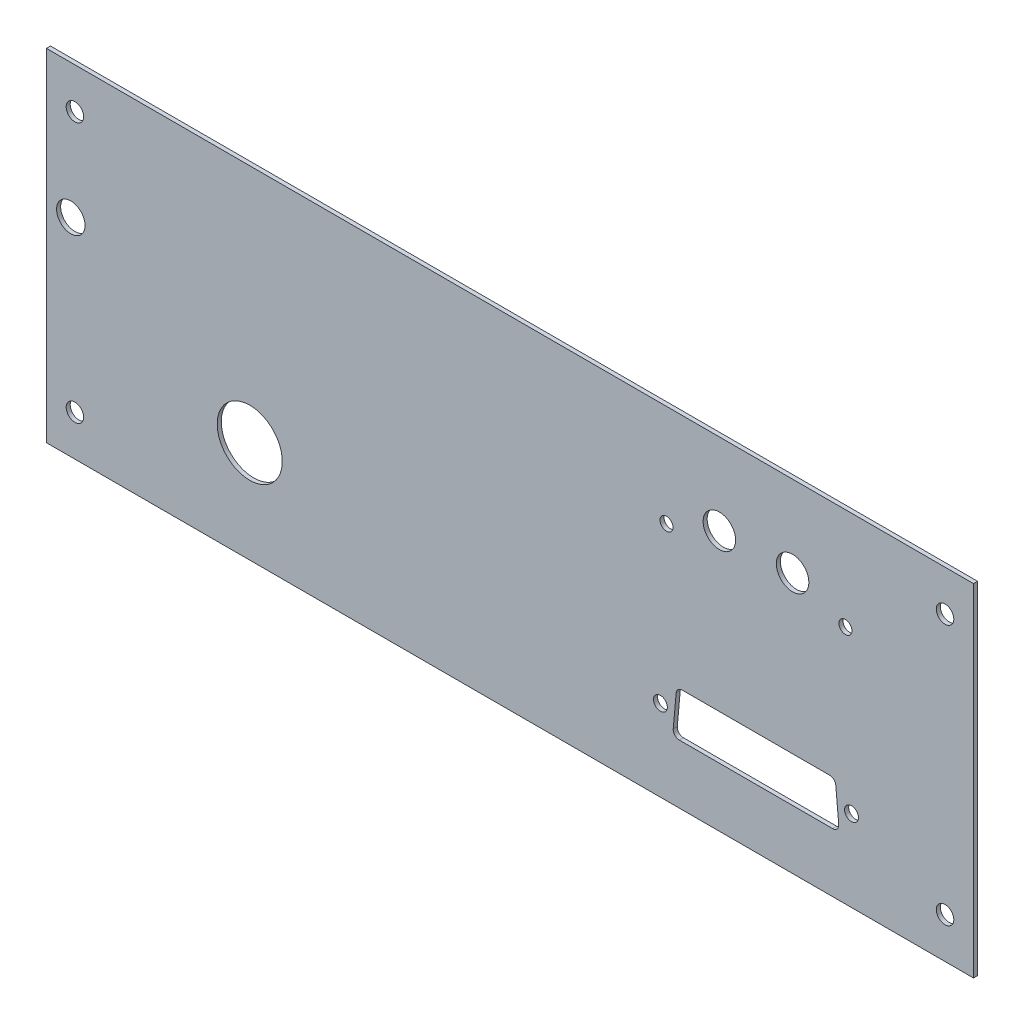
ISO-10303-21;
HEADER;
FILE_DESCRIPTION(('STEP AP214'),'2;1');
FILE_NAME('part.step','',(''),(''),'','','');
FILE_SCHEMA(('AUTOMOTIVE_DESIGN { 1 0 10303 214 1 1 1 1 }'));
ENDSEC;
DATA;
#1=APPLICATION_CONTEXT('core data for automotive mechanical design processes');
#2=APPLICATION_PROTOCOL_DEFINITION('international standard','automotive_design',2000,#1);
#3=PRODUCT_CONTEXT('',#1,'mechanical');
#4=PRODUCT('Part','Part','',(#3));
#5=PRODUCT_RELATED_PRODUCT_CATEGORY('part','',(#4));
#6=PRODUCT_DEFINITION_FORMATION('','',#4);
#7=PRODUCT_DEFINITION_CONTEXT('part definition',#1,'design');
#8=PRODUCT_DEFINITION('design','',#6,#7);
#9=PRODUCT_DEFINITION_SHAPE('','',#8);
#10=(LENGTH_UNIT() NAMED_UNIT(*) SI_UNIT(.MILLI.,.METRE.));
#11=(NAMED_UNIT(*) PLANE_ANGLE_UNIT() SI_UNIT($,.RADIAN.));
#12=(NAMED_UNIT(*) SI_UNIT($,.STERADIAN.) SOLID_ANGLE_UNIT());
#13=UNCERTAINTY_MEASURE_WITH_UNIT(LENGTH_MEASURE(1.E-05),#10,'distance_accuracy_value','');
#14=(GEOMETRIC_REPRESENTATION_CONTEXT(3) GLOBAL_UNCERTAINTY_ASSIGNED_CONTEXT((#13)) GLOBAL_UNIT_ASSIGNED_CONTEXT((#10,
#11,#12)) REPRESENTATION_CONTEXT('',''));
#15=CARTESIAN_POINT('',(0.,0.,0.));
#16=DIRECTION('',(0.,0.,1.));
#17=DIRECTION('',(1.,0.,0.));
#18=AXIS2_PLACEMENT_3D('',#15,#16,#17);
#19=CARTESIAN_POINT('',(-114.,-42.,1.));
#20=DIRECTION('',(0.,0.,-1.));
#21=DIRECTION('',(-1.,0.,0.));
#22=AXIS2_PLACEMENT_3D('',#19,#20,#21);
#23=PLANE('',#22);
#24=CARTESIAN_POINT('',(-64.,-17.,1.));
#25=DIRECTION('',(0.,0.,1.));
#26=DIRECTION('',(1.,0.,0.));
#27=AXIS2_PLACEMENT_3D('',#24,#25,#26);
#28=CIRCLE('',#27,8.);
#29=CARTESIAN_POINT('',(-56.,-17.,1.));
#30=VERTEX_POINT('',#29);
#31=EDGE_CURVE('E603',#30,#30,#28,.T.);
#32=ORIENTED_EDGE('',*,*,#31,.F.);
#33=EDGE_LOOP('',(#32));
#34=FACE_BOUND('',#33,.T.);
#35=CARTESIAN_POINT('',(-108.,8.99999999999999,1.));
#36=DIRECTION('',(0.,0.,1.));
#37=DIRECTION('',(1.,0.,0.));
#38=AXIS2_PLACEMENT_3D('',#35,#36,#37);
#39=CIRCLE('',#38,3.50000000000001);
#40=CARTESIAN_POINT('',(-104.5,8.99999999999999,1.));
#41=VERTEX_POINT('',#40);
#42=EDGE_CURVE('E596',#41,#41,#39,.T.);
#43=ORIENTED_EDGE('',*,*,#42,.F.);
#44=EDGE_LOOP('',(#43));
#45=FACE_BOUND('',#44,.T.);
#46=CARTESIAN_POINT('',(69.5,22.,1.));
#47=DIRECTION('',(0.,0.,1.));
#48=DIRECTION('',(1.,0.,0.));
#49=AXIS2_PLACEMENT_3D('',#46,#47,#48);
#50=CIRCLE('',#49,4.00000000000002);
#51=CARTESIAN_POINT('',(73.5,22.,1.));
#52=VERTEX_POINT('',#51);
#53=EDGE_CURVE('E266',#52,#52,#50,.T.);
#54=ORIENTED_EDGE('',*,*,#53,.F.);
#55=EDGE_LOOP('',(#54));
#56=FACE_BOUND('',#55,.T.);
#57=CARTESIAN_POINT('',(51.5,22.,1.));
#58=DIRECTION('',(0.,0.,1.));
#59=DIRECTION('',(1.,0.,0.));
#60=AXIS2_PLACEMENT_3D('',#57,#58,#59);
#61=CIRCLE('',#60,4.00000000000001);
#62=CARTESIAN_POINT('',(55.5,22.,1.));
#63=VERTEX_POINT('',#62);
#64=EDGE_CURVE('E256',#63,#63,#61,.T.);
#65=ORIENTED_EDGE('',*,*,#64,.F.);
#66=EDGE_LOOP('',(#65));
#67=FACE_BOUND('',#66,.T.);
#68=CARTESIAN_POINT('',(82.5,17.,1.));
#69=DIRECTION('',(0.,0.,1.));
#70=DIRECTION('',(1.,0.,0.));
#71=AXIS2_PLACEMENT_3D('',#68,#69,#70);
#72=CIRCLE('',#71,1.6);
#73=CARTESIAN_POINT('',(84.1,17.,1.));
#74=VERTEX_POINT('',#73);
#75=EDGE_CURVE('E253',#74,#74,#72,.T.);
#76=ORIENTED_EDGE('',*,*,#75,.F.);
#77=EDGE_LOOP('',(#76));
#78=FACE_BOUND('',#77,.T.);
#79=CARTESIAN_POINT('',(38.5,17.,1.));
#80=DIRECTION('',(0.,0.,1.));
#81=DIRECTION('',(1.,0.,0.));
#82=AXIS2_PLACEMENT_3D('',#79,#80,#81);
#83=CIRCLE('',#82,1.6);
#84=CARTESIAN_POINT('',(40.1,17.,1.));
#85=VERTEX_POINT('',#84);
#86=EDGE_CURVE('E250',#85,#85,#83,.T.);
#87=ORIENTED_EDGE('',*,*,#86,.F.);
#88=EDGE_LOOP('',(#87));
#89=FACE_BOUND('',#88,.T.);
#90=DIRECTION('',(1.,0.,0.));
#91=VECTOR('',#90,1.);
#92=CARTESIAN_POINT('',(41.6425492296165,-27.5,1.));
#93=LINE('',#92,#91);
#94=CARTESIAN_POINT('',(41.6425492296165,-27.5,1.));
#95=VERTEX_POINT('',#94);
#96=CARTESIAN_POINT('',(79.3574507703836,-27.5,1.));
#97=VERTEX_POINT('',#96);
#98=EDGE_CURVE('E133',#95,#97,#93,.T.);
#99=ORIENTED_EDGE('',*,*,#98,.F.);
#100=CARTESIAN_POINT('',(41.6425492296165,-26.,1.));
#101=DIRECTION('',(0.,0.,1.));
#102=DIRECTION('',(-1.,0.,0.));
#103=AXIS2_PLACEMENT_3D('',#100,#101,#102);
#104=CIRCLE('',#103,1.5);
#105=CARTESIAN_POINT('',(40.1487094199149,-25.8641963809362,1.));
#106=VERTEX_POINT('',#105);
#107=EDGE_CURVE('E48',#106,#95,#104,.T.);
#108=ORIENTED_EDGE('',*,*,#107,.F.);
#109=DIRECTION('',(-0.090535746042518,-0.995893206467704,0.));
#110=VECTOR('',#109,1.);
#111=CARTESIAN_POINT('',(40.1487094199149,-25.8641963809362,1.));
#112=LINE('',#111,#110);
#113=CARTESIAN_POINT('',(40.8759821471876,-17.8641963809362,1.));
#114=VERTEX_POINT('',#113);
#115=EDGE_CURVE('E154',#114,#106,#112,.T.);
#116=ORIENTED_EDGE('',*,*,#115,.F.);
#117=CARTESIAN_POINT('',(42.3698219568892,-18.,1.));
#118=DIRECTION('',(0.,0.,1.));
#119=DIRECTION('',(1.,0.,0.));
#120=AXIS2_PLACEMENT_3D('',#117,#118,#119);
#121=CIRCLE('',#120,1.5);
#122=CARTESIAN_POINT('',(42.3698219568892,-16.5,1.));
#123=VERTEX_POINT('',#122);
#124=EDGE_CURVE('E151',#123,#114,#121,.T.);
#125=ORIENTED_EDGE('',*,*,#124,.F.);
#126=DIRECTION('',(-1.,0.,0.));
#127=VECTOR('',#126,1.);
#128=CARTESIAN_POINT('',(42.3698219568892,-16.5,1.));
#129=LINE('',#128,#127);
#130=CARTESIAN_POINT('',(78.6301780431108,-16.5,1.));
#131=VERTEX_POINT('',#130);
#132=EDGE_CURVE('E148',#131,#123,#129,.T.);
#133=ORIENTED_EDGE('',*,*,#132,.F.);
#134=CARTESIAN_POINT('',(78.6301780431108,-18.,1.));
#135=DIRECTION('',(0.,0.,1.));
#136=DIRECTION('',(1.,0.,0.));
#137=AXIS2_PLACEMENT_3D('',#134,#135,#136);
#138=CIRCLE('',#137,1.5);
#139=CARTESIAN_POINT('',(80.1240178528124,-17.8641963809362,1.));
#140=VERTEX_POINT('',#139);
#141=EDGE_CURVE('E142',#140,#131,#138,.T.);
#142=ORIENTED_EDGE('',*,*,#141,.F.);
#143=DIRECTION('',(-0.0905357460425171,0.995893206467704,0.));
#144=VECTOR('',#143,1.);
#145=CARTESIAN_POINT('',(80.8512905800851,-25.8641963809362,1.));
#146=LINE('',#145,#144);
#147=CARTESIAN_POINT('',(80.8512905800851,-25.8641963809362,1.));
#148=VERTEX_POINT('',#147);
#149=EDGE_CURVE('E140',#148,#140,#146,.T.);
#150=ORIENTED_EDGE('',*,*,#149,.F.);
#151=CARTESIAN_POINT('',(79.3574507703836,-26.,1.));
#152=DIRECTION('',(0.,0.,1.));
#153=DIRECTION('',(1.,0.,0.));
#154=AXIS2_PLACEMENT_3D('',#151,#152,#153);
#155=CIRCLE('',#154,1.49999999999999);
#156=EDGE_CURVE('E124',#97,#148,#155,.T.);
#157=ORIENTED_EDGE('',*,*,#156,.F.);
#158=EDGE_LOOP('',(#99,#108,#116,#125,#133,#142,#150,#157));
#159=FACE_BOUND('',#158,.T.);
#160=CARTESIAN_POINT('',(84.,-22.,1.));
#161=DIRECTION('',(0.,0.,1.));
#162=DIRECTION('',(1.,0.,0.));
#163=AXIS2_PLACEMENT_3D('',#160,#161,#162);
#164=CIRCLE('',#163,1.69999999999996);
#165=CARTESIAN_POINT('',(85.7,-22.,1.));
#166=VERTEX_POINT('',#165);
#167=EDGE_CURVE('E159',#166,#166,#164,.T.);
#168=ORIENTED_EDGE('',*,*,#167,.F.);
#169=EDGE_LOOP('',(#168));
#170=FACE_BOUND('',#169,.T.);
#171=CARTESIAN_POINT('',(37.,-22.,1.));
#172=DIRECTION('',(0.,0.,1.));
#173=DIRECTION('',(1.,0.,0.));
#174=AXIS2_PLACEMENT_3D('',#171,#172,#173);
#175=CIRCLE('',#174,1.70000000000001);
#176=CARTESIAN_POINT('',(38.7,-22.,1.));
#177=VERTEX_POINT('',#176);
#178=EDGE_CURVE('E173',#177,#177,#175,.T.);
#179=ORIENTED_EDGE('',*,*,#178,.F.);
#180=EDGE_LOOP('',(#179));
#181=FACE_BOUND('',#180,.T.);
#182=CARTESIAN_POINT('',(-107.,-32.,1.));
#183=DIRECTION('',(0.,0.,1.));
#184=DIRECTION('',(1.,0.,0.));
#185=AXIS2_PLACEMENT_3D('',#182,#183,#184);
#186=CIRCLE('',#185,2.15);
#187=CARTESIAN_POINT('',(-104.85,-32.,1.));
#188=VERTEX_POINT('',#187);
#189=EDGE_CURVE('E184',#188,#188,#186,.T.);
#190=ORIENTED_EDGE('',*,*,#189,.F.);
#191=EDGE_LOOP('',(#190));
#192=FACE_BOUND('',#191,.T.);
#193=CARTESIAN_POINT('',(107.,32.,1.));
#194=DIRECTION('',(0.,0.,1.));
#195=DIRECTION('',(1.,0.,0.));
#196=AXIS2_PLACEMENT_3D('',#193,#194,#195);
#197=CIRCLE('',#196,2.15);
#198=CARTESIAN_POINT('',(109.15,32.,1.));
#199=VERTEX_POINT('',#198);
#200=EDGE_CURVE('E196',#199,#199,#197,.T.);
#201=ORIENTED_EDGE('',*,*,#200,.F.);
#202=EDGE_LOOP('',(#201));
#203=FACE_BOUND('',#202,.T.);
#204=DIRECTION('',(0.,-1.,0.));
#205=VECTOR('',#204,1.);
#206=CARTESIAN_POINT('',(-114.,-42.,1.));
#207=LINE('',#206,#205);
#208=CARTESIAN_POINT('',(-114.,42.,1.));
#209=VERTEX_POINT('',#208);
#210=CARTESIAN_POINT('',(-114.,-42.,1.));
#211=VERTEX_POINT('',#210);
#212=EDGE_CURVE('E202',#209,#211,#207,.T.);
#213=ORIENTED_EDGE('',*,*,#212,.T.);
#214=DIRECTION('',(1.,0.,0.));
#215=VECTOR('',#214,1.);
#216=CARTESIAN_POINT('',(-114.,-42.,1.));
#217=LINE('',#216,#215);
#218=CARTESIAN_POINT('',(114.,-42.,1.));
#219=VERTEX_POINT('',#218);
#220=EDGE_CURVE('E205',#211,#219,#217,.T.);
#221=ORIENTED_EDGE('',*,*,#220,.T.);
#222=DIRECTION('',(0.,1.,0.));
#223=VECTOR('',#222,1.);
#224=CARTESIAN_POINT('',(114.,-42.,1.));
#225=LINE('',#224,#223);
#226=CARTESIAN_POINT('',(114.,42.,1.));
#227=VERTEX_POINT('',#226);
#228=EDGE_CURVE('E208',#219,#227,#225,.T.);
#229=ORIENTED_EDGE('',*,*,#228,.T.);
#230=DIRECTION('',(-1.,0.,0.));
#231=VECTOR('',#230,1.);
#232=CARTESIAN_POINT('',(-114.,42.,1.));
#233=LINE('',#232,#231);
#234=EDGE_CURVE('E210',#227,#209,#233,.T.);
#235=ORIENTED_EDGE('',*,*,#234,.T.);
#236=EDGE_LOOP('',(#213,#221,#229,#235));
#237=FACE_BOUND('',#236,.T.);
#238=CARTESIAN_POINT('',(-107.,32.,1.));
#239=DIRECTION('',(0.,0.,1.));
#240=DIRECTION('',(-1.,0.,0.));
#241=AXIS2_PLACEMENT_3D('',#238,#239,#240);
#242=CIRCLE('',#241,2.15);
#243=CARTESIAN_POINT('',(-109.15,32.,1.));
#244=VERTEX_POINT('',#243);
#245=EDGE_CURVE('E190',#244,#244,#242,.T.);
#246=ORIENTED_EDGE('',*,*,#245,.F.);
#247=EDGE_LOOP('',(#246));
#248=FACE_BOUND('',#247,.T.);
#249=CARTESIAN_POINT('',(107.,-32.,1.));
#250=DIRECTION('',(0.,0.,1.));
#251=DIRECTION('',(-1.,0.,0.));
#252=AXIS2_PLACEMENT_3D('',#249,#250,#251);
#253=CIRCLE('',#252,2.15);
#254=CARTESIAN_POINT('',(104.85,-32.,1.));
#255=VERTEX_POINT('',#254);
#256=EDGE_CURVE('E177',#255,#255,#253,.T.);
#257=ORIENTED_EDGE('',*,*,#256,.F.);
#258=EDGE_LOOP('',(#257));
#259=FACE_BOUND('',#258,.T.);
#260=ADVANCED_FACE('F31',(#34,#45,#56,#67,#78,#89,#159,#170,#181,#192,#203,#237,#248,#259),#23,.F.);
#261=CARTESIAN_POINT('',(-114.,-42.,0.));
#262=DIRECTION('',(0.,0.,-1.));
#263=DIRECTION('',(-1.,0.,0.));
#264=AXIS2_PLACEMENT_3D('',#261,#262,#263);
#265=PLANE('',#264);
#266=CARTESIAN_POINT('',(-64.,-17.,0.));
#267=DIRECTION('',(0.,0.,1.));
#268=DIRECTION('',(1.,0.,0.));
#269=AXIS2_PLACEMENT_3D('',#266,#267,#268);
#270=CIRCLE('',#269,8.);
#271=CARTESIAN_POINT('',(-56.,-17.,0.));
#272=VERTEX_POINT('',#271);
#273=EDGE_CURVE('E601',#272,#272,#270,.T.);
#274=ORIENTED_EDGE('',*,*,#273,.T.);
#275=EDGE_LOOP('',(#274));
#276=FACE_BOUND('',#275,.T.);
#277=CARTESIAN_POINT('',(-108.,8.99999999999999,0.));
#278=DIRECTION('',(0.,0.,1.));
#279=DIRECTION('',(1.,0.,0.));
#280=AXIS2_PLACEMENT_3D('',#277,#278,#279);
#281=CIRCLE('',#280,3.50000000000001);
#282=CARTESIAN_POINT('',(-104.5,8.99999999999999,0.));
#283=VERTEX_POINT('',#282);
#284=EDGE_CURVE('E594',#283,#283,#281,.T.);
#285=ORIENTED_EDGE('',*,*,#284,.T.);
#286=EDGE_LOOP('',(#285));
#287=FACE_BOUND('',#286,.T.);
#288=CARTESIAN_POINT('',(69.5,22.,0.));
#289=DIRECTION('',(0.,0.,-1.));
#290=DIRECTION('',(-1.,0.,0.));
#291=AXIS2_PLACEMENT_3D('',#288,#289,#290);
#292=CIRCLE('',#291,4.00000000000002);
#293=CARTESIAN_POINT('',(65.5,22.,0.));
#294=VERTEX_POINT('',#293);
#295=EDGE_CURVE('E35',#294,#294,#292,.T.);
#296=ORIENTED_EDGE('',*,*,#295,.F.);
#297=EDGE_LOOP('',(#296));
#298=FACE_BOUND('',#297,.T.);
#299=CARTESIAN_POINT('',(51.5,22.,0.));
#300=DIRECTION('',(0.,0.,-1.));
#301=DIRECTION('',(-1.,0.,0.));
#302=AXIS2_PLACEMENT_3D('',#299,#300,#301);
#303=CIRCLE('',#302,4.00000000000001);
#304=CARTESIAN_POINT('',(47.5,22.,0.));
#305=VERTEX_POINT('',#304);
#306=EDGE_CURVE('E254',#305,#305,#303,.T.);
#307=ORIENTED_EDGE('',*,*,#306,.F.);
#308=EDGE_LOOP('',(#307));
#309=FACE_BOUND('',#308,.T.);
#310=CARTESIAN_POINT('',(82.5,17.,0.));
#311=DIRECTION('',(0.,0.,-1.));
#312=DIRECTION('',(-1.,0.,0.));
#313=AXIS2_PLACEMENT_3D('',#310,#311,#312);
#314=CIRCLE('',#313,1.6);
#315=CARTESIAN_POINT('',(80.9,17.,0.));
#316=VERTEX_POINT('',#315);
#317=EDGE_CURVE('E251',#316,#316,#314,.T.);
#318=ORIENTED_EDGE('',*,*,#317,.F.);
#319=EDGE_LOOP('',(#318));
#320=FACE_BOUND('',#319,.T.);
#321=CARTESIAN_POINT('',(38.5,17.,0.));
#322=DIRECTION('',(0.,0.,-1.));
#323=DIRECTION('',(-1.,0.,0.));
#324=AXIS2_PLACEMENT_3D('',#321,#322,#323);
#325=CIRCLE('',#324,1.6);
#326=CARTESIAN_POINT('',(36.9,17.,0.));
#327=VERTEX_POINT('',#326);
#328=EDGE_CURVE('E247',#327,#327,#325,.T.);
#329=ORIENTED_EDGE('',*,*,#328,.F.);
#330=EDGE_LOOP('',(#329));
#331=FACE_BOUND('',#330,.T.);
#332=CARTESIAN_POINT('',(41.6425492296165,-26.,0.));
#333=DIRECTION('',(0.,0.,-1.));
#334=DIRECTION('',(-1.,0.,0.));
#335=AXIS2_PLACEMENT_3D('',#332,#333,#334);
#336=CIRCLE('',#335,1.5);
#337=CARTESIAN_POINT('',(41.6425492296165,-27.5,0.));
#338=VERTEX_POINT('',#337);
#339=CARTESIAN_POINT('',(40.1487094199149,-25.8641963809362,0.));
#340=VERTEX_POINT('',#339);
#341=EDGE_CURVE('E11',#338,#340,#336,.T.);
#342=ORIENTED_EDGE('',*,*,#341,.F.);
#343=DIRECTION('',(-1.,0.,0.));
#344=VECTOR('',#343,1.);
#345=CARTESIAN_POINT('',(-114.,-27.5,0.));
#346=LINE('',#345,#344);
#347=CARTESIAN_POINT('',(79.3574507703836,-27.5,0.));
#348=VERTEX_POINT('',#347);
#349=EDGE_CURVE('E231',#348,#338,#346,.T.);
#350=ORIENTED_EDGE('',*,*,#349,.F.);
#351=CARTESIAN_POINT('',(79.3574507703836,-26.,0.));
#352=DIRECTION('',(0.,0.,-1.));
#353=DIRECTION('',(-1.,0.,0.));
#354=AXIS2_PLACEMENT_3D('',#351,#352,#353);
#355=CIRCLE('',#354,1.49999999999999);
#356=CARTESIAN_POINT('',(80.8512905800851,-25.8641963809362,0.));
#357=VERTEX_POINT('',#356);
#358=EDGE_CURVE('E127',#357,#348,#355,.T.);
#359=ORIENTED_EDGE('',*,*,#358,.F.);
#360=DIRECTION('',(0.0905357460425171,-0.995893206467704,0.));
#361=VECTOR('',#360,1.);
#362=CARTESIAN_POINT('',(80.7090163934426,-24.2991803278691,0.));
#363=LINE('',#362,#361);
#364=CARTESIAN_POINT('',(80.1240178528124,-17.8641963809362,0.));
#365=VERTEX_POINT('',#364);
#366=EDGE_CURVE('E238',#365,#357,#363,.T.);
#367=ORIENTED_EDGE('',*,*,#366,.F.);
#368=CARTESIAN_POINT('',(78.6301780431108,-18.,0.));
#369=DIRECTION('',(0.,0.,-1.));
#370=DIRECTION('',(-1.,0.,0.));
#371=AXIS2_PLACEMENT_3D('',#368,#369,#370);
#372=CIRCLE('',#371,1.5);
#373=CARTESIAN_POINT('',(78.6301780431108,-16.5,0.));
#374=VERTEX_POINT('',#373);
#375=EDGE_CURVE('E240',#374,#365,#372,.T.);
#376=ORIENTED_EDGE('',*,*,#375,.F.);
#377=DIRECTION('',(1.,0.,0.));
#378=VECTOR('',#377,1.);
#379=CARTESIAN_POINT('',(-114.,-16.5,0.));
#380=LINE('',#379,#378);
#381=CARTESIAN_POINT('',(42.3698219568892,-16.5,0.));
#382=VERTEX_POINT('',#381);
#383=EDGE_CURVE('E242',#382,#374,#380,.T.);
#384=ORIENTED_EDGE('',*,*,#383,.F.);
#385=CARTESIAN_POINT('',(42.3698219568892,-18.,0.));
#386=DIRECTION('',(0.,0.,-1.));
#387=DIRECTION('',(-1.,0.,0.));
#388=AXIS2_PLACEMENT_3D('',#385,#386,#387);
#389=CIRCLE('',#388,1.5);
#390=CARTESIAN_POINT('',(40.8759821471876,-17.8641963809362,0.));
#391=VERTEX_POINT('',#390);
#392=EDGE_CURVE('E244',#391,#382,#389,.T.);
#393=ORIENTED_EDGE('',*,*,#392,.F.);
#394=DIRECTION('',(0.090535746042518,0.995893206467704,0.));
#395=VECTOR('',#394,1.);
#396=CARTESIAN_POINT('',(37.4303278688525,-55.7663934426229,0.));
#397=LINE('',#396,#395);
#398=EDGE_CURVE('E40',#340,#391,#397,.T.);
#399=ORIENTED_EDGE('',*,*,#398,.F.);
#400=EDGE_LOOP('',(#342,#350,#359,#367,#376,#384,#393,#399));
#401=FACE_BOUND('',#400,.T.);
#402=CARTESIAN_POINT('',(84.,-22.,0.));
#403=DIRECTION('',(0.,0.,-1.));
#404=DIRECTION('',(-1.,0.,0.));
#405=AXIS2_PLACEMENT_3D('',#402,#403,#404);
#406=CIRCLE('',#405,1.69999999999996);
#407=CARTESIAN_POINT('',(82.3000000000001,-22.,0.));
#408=VERTEX_POINT('',#407);
#409=EDGE_CURVE('E172',#408,#408,#406,.T.);
#410=ORIENTED_EDGE('',*,*,#409,.F.);
#411=EDGE_LOOP('',(#410));
#412=FACE_BOUND('',#411,.T.);
#413=CARTESIAN_POINT('',(37.,-22.,0.));
#414=DIRECTION('',(0.,0.,-1.));
#415=DIRECTION('',(-1.,0.,0.));
#416=AXIS2_PLACEMENT_3D('',#413,#414,#415);
#417=CIRCLE('',#416,1.70000000000001);
#418=CARTESIAN_POINT('',(35.3,-22.,0.));
#419=VERTEX_POINT('',#418);
#420=EDGE_CURVE('E176',#419,#419,#417,.T.);
#421=ORIENTED_EDGE('',*,*,#420,.F.);
#422=EDGE_LOOP('',(#421));
#423=FACE_BOUND('',#422,.T.);
#424=CARTESIAN_POINT('',(-107.,-32.,0.));
#425=DIRECTION('',(0.,0.,1.));
#426=DIRECTION('',(1.,0.,0.));
#427=AXIS2_PLACEMENT_3D('',#424,#425,#426);
#428=CIRCLE('',#427,2.15);
#429=CARTESIAN_POINT('',(-104.85,-32.,0.));
#430=VERTEX_POINT('',#429);
#431=EDGE_CURVE('E180',#430,#430,#428,.T.);
#432=ORIENTED_EDGE('',*,*,#431,.T.);
#433=EDGE_LOOP('',(#432));
#434=FACE_BOUND('',#433,.T.);
#435=CARTESIAN_POINT('',(107.,32.,0.));
#436=DIRECTION('',(0.,0.,1.));
#437=DIRECTION('',(1.,0.,0.));
#438=AXIS2_PLACEMENT_3D('',#435,#436,#437);
#439=CIRCLE('',#438,2.15);
#440=CARTESIAN_POINT('',(109.15,32.,0.));
#441=VERTEX_POINT('',#440);
#442=EDGE_CURVE('E193',#441,#441,#439,.T.);
#443=ORIENTED_EDGE('',*,*,#442,.T.);
#444=EDGE_LOOP('',(#443));
#445=FACE_BOUND('',#444,.T.);
#446=DIRECTION('',(0.,-1.,0.));
#447=VECTOR('',#446,1.);
#448=CARTESIAN_POINT('',(-114.,-42.,0.));
#449=LINE('',#448,#447);
#450=CARTESIAN_POINT('',(-114.,42.,0.));
#451=VERTEX_POINT('',#450);
#452=CARTESIAN_POINT('',(-114.,-42.,0.));
#453=VERTEX_POINT('',#452);
#454=EDGE_CURVE('E199',#451,#453,#449,.T.);
#455=ORIENTED_EDGE('',*,*,#454,.F.);
#456=DIRECTION('',(-1.,0.,0.));
#457=VECTOR('',#456,1.);
#458=CARTESIAN_POINT('',(-114.,42.,0.));
#459=LINE('',#458,#457);
#460=CARTESIAN_POINT('',(114.,42.,0.));
#461=VERTEX_POINT('',#460);
#462=EDGE_CURVE('E206',#461,#451,#459,.T.);
#463=ORIENTED_EDGE('',*,*,#462,.F.);
#464=DIRECTION('',(0.,1.,0.));
#465=VECTOR('',#464,1.);
#466=CARTESIAN_POINT('',(114.,-42.,0.));
#467=LINE('',#466,#465);
#468=CARTESIAN_POINT('',(114.,-42.,0.));
#469=VERTEX_POINT('',#468);
#470=EDGE_CURVE('E217',#469,#461,#467,.T.);
#471=ORIENTED_EDGE('',*,*,#470,.F.);
#472=DIRECTION('',(1.,0.,0.));
#473=VECTOR('',#472,1.);
#474=CARTESIAN_POINT('',(-114.,-42.,0.));
#475=LINE('',#474,#473);
#476=EDGE_CURVE('E215',#453,#469,#475,.T.);
#477=ORIENTED_EDGE('',*,*,#476,.F.);
#478=EDGE_LOOP('',(#455,#463,#471,#477));
#479=FACE_BOUND('',#478,.T.);
#480=CARTESIAN_POINT('',(-107.,32.,0.));
#481=DIRECTION('',(0.,0.,1.));
#482=DIRECTION('',(-1.,0.,0.));
#483=AXIS2_PLACEMENT_3D('',#480,#481,#482);
#484=CIRCLE('',#483,2.15);
#485=CARTESIAN_POINT('',(-109.15,32.,0.));
#486=VERTEX_POINT('',#485);
#487=EDGE_CURVE('E187',#486,#486,#484,.T.);
#488=ORIENTED_EDGE('',*,*,#487,.T.);
#489=EDGE_LOOP('',(#488));
#490=FACE_BOUND('',#489,.T.);
#491=CARTESIAN_POINT('',(107.,-32.,0.));
#492=DIRECTION('',(0.,0.,1.));
#493=DIRECTION('',(-1.,0.,0.));
#494=AXIS2_PLACEMENT_3D('',#491,#492,#493);
#495=CIRCLE('',#494,2.15);
#496=CARTESIAN_POINT('',(104.85,-32.,0.));
#497=VERTEX_POINT('',#496);
#498=EDGE_CURVE('E181',#497,#497,#495,.T.);
#499=ORIENTED_EDGE('',*,*,#498,.T.);
#500=EDGE_LOOP('',(#499));
#501=FACE_BOUND('',#500,.T.);
#502=ADVANCED_FACE('F276',(#276,#287,#298,#309,#320,#331,#401,#412,#423,#434,#445,#479,#490,
#501),#265,.T.);
#503=CARTESIAN_POINT('',(-114.,-42.,1.));
#504=DIRECTION('',(1.,0.,0.));
#505=DIRECTION('',(0.,0.,-1.));
#506=AXIS2_PLACEMENT_3D('',#503,#504,#505);
#507=PLANE('',#506);
#508=ORIENTED_EDGE('',*,*,#454,.T.);
#509=DIRECTION('',(0.,0.,-1.));
#510=VECTOR('',#509,1.);
#511=CARTESIAN_POINT('',(-114.,-42.,1.));
#512=LINE('',#511,#510);
#513=EDGE_CURVE('E228',#211,#453,#512,.T.);
#514=ORIENTED_EDGE('',*,*,#513,.F.);
#515=ORIENTED_EDGE('',*,*,#212,.F.);
#516=DIRECTION('',(0.,0.,-1.));
#517=VECTOR('',#516,1.);
#518=CARTESIAN_POINT('',(-114.,42.,1.));
#519=LINE('',#518,#517);
#520=EDGE_CURVE('E212',#209,#451,#519,.T.);
#521=ORIENTED_EDGE('',*,*,#520,.T.);
#522=EDGE_LOOP('',(#508,#514,#515,#521));
#523=FACE_BOUND('',#522,.T.);
#524=ADVANCED_FACE('F33',(#523),#507,.F.);
#525=CARTESIAN_POINT('',(-114.,-42.,1.));
#526=DIRECTION('',(0.,1.,0.));
#527=DIRECTION('',(0.,0.,1.));
#528=AXIS2_PLACEMENT_3D('',#525,#526,#527);
#529=PLANE('',#528);
#530=ORIENTED_EDGE('',*,*,#476,.T.);
#531=DIRECTION('',(0.,0.,-1.));
#532=VECTOR('',#531,1.);
#533=CARTESIAN_POINT('',(114.,-42.,1.));
#534=LINE('',#533,#532);
#535=EDGE_CURVE('E225',#219,#469,#534,.T.);
#536=ORIENTED_EDGE('',*,*,#535,.F.);
#537=ORIENTED_EDGE('',*,*,#220,.F.);
#538=ORIENTED_EDGE('',*,*,#513,.T.);
#539=EDGE_LOOP('',(#530,#536,#537,#538));
#540=FACE_BOUND('',#539,.T.);
#541=ADVANCED_FACE('F296',(#540),#529,.F.);
#542=CARTESIAN_POINT('',(114.,-42.,1.));
#543=DIRECTION('',(-1.,0.,0.));
#544=DIRECTION('',(0.,0.,1.));
#545=AXIS2_PLACEMENT_3D('',#542,#543,#544);
#546=PLANE('',#545);
#547=ORIENTED_EDGE('',*,*,#470,.T.);
#548=DIRECTION('',(0.,0.,-1.));
#549=VECTOR('',#548,1.);
#550=CARTESIAN_POINT('',(114.,42.,1.));
#551=LINE('',#550,#549);
#552=EDGE_CURVE('E222',#227,#461,#551,.T.);
#553=ORIENTED_EDGE('',*,*,#552,.F.);
#554=ORIENTED_EDGE('',*,*,#228,.F.);
#555=ORIENTED_EDGE('',*,*,#535,.T.);
#556=EDGE_LOOP('',(#547,#553,#554,#555));
#557=FACE_BOUND('',#556,.T.);
#558=ADVANCED_FACE('F293',(#557),#546,.F.);
#559=CARTESIAN_POINT('',(-114.,42.,1.));
#560=DIRECTION('',(0.,-1.,0.));
#561=DIRECTION('',(1.,0.,0.));
#562=AXIS2_PLACEMENT_3D('',#559,#560,#561);
#563=PLANE('',#562);
#564=ORIENTED_EDGE('',*,*,#462,.T.);
#565=ORIENTED_EDGE('',*,*,#520,.F.);
#566=ORIENTED_EDGE('',*,*,#234,.F.);
#567=ORIENTED_EDGE('',*,*,#552,.T.);
#568=EDGE_LOOP('',(#564,#565,#566,#567));
#569=FACE_BOUND('',#568,.T.);
#570=ADVANCED_FACE('F290',(#569),#563,.F.);
#571=CARTESIAN_POINT('',(107.,32.,1.));
#572=DIRECTION('',(0.,0.,-1.));
#573=DIRECTION('',(-1.,0.,0.));
#574=AXIS2_PLACEMENT_3D('',#571,#572,#573);
#575=CYLINDRICAL_SURFACE('',#574,2.15);
#576=ORIENTED_EDGE('',*,*,#200,.T.);
#577=EDGE_LOOP('',(#576));
#578=FACE_BOUND('',#577,.T.);
#579=ORIENTED_EDGE('',*,*,#442,.F.);
#580=EDGE_LOOP('',(#579));
#581=FACE_BOUND('',#580,.T.);
#582=ADVANCED_FACE('F287',(#578,#581),#575,.F.);
#583=CARTESIAN_POINT('',(-107.,32.,1.));
#584=DIRECTION('',(0.,0.,-1.));
#585=DIRECTION('',(-1.,0.,0.));
#586=AXIS2_PLACEMENT_3D('',#583,#584,#585);
#587=CYLINDRICAL_SURFACE('',#586,2.15);
#588=ORIENTED_EDGE('',*,*,#245,.T.);
#589=EDGE_LOOP('',(#588));
#590=FACE_BOUND('',#589,.T.);
#591=ORIENTED_EDGE('',*,*,#487,.F.);
#592=EDGE_LOOP('',(#591));
#593=FACE_BOUND('',#592,.T.);
#594=ADVANCED_FACE('F337',(#590,#593),#587,.F.);
#595=CARTESIAN_POINT('',(-107.,-32.,1.));
#596=DIRECTION('',(0.,0.,-1.));
#597=DIRECTION('',(-1.,0.,0.));
#598=AXIS2_PLACEMENT_3D('',#595,#596,#597);
#599=CYLINDRICAL_SURFACE('',#598,2.15);
#600=ORIENTED_EDGE('',*,*,#189,.T.);
#601=EDGE_LOOP('',(#600));
#602=FACE_BOUND('',#601,.T.);
#603=ORIENTED_EDGE('',*,*,#431,.F.);
#604=EDGE_LOOP('',(#603));
#605=FACE_BOUND('',#604,.T.);
#606=ADVANCED_FACE('F326',(#602,#605),#599,.F.);
#607=CARTESIAN_POINT('',(107.,-32.,1.));
#608=DIRECTION('',(0.,0.,-1.));
#609=DIRECTION('',(-1.,0.,0.));
#610=AXIS2_PLACEMENT_3D('',#607,#608,#609);
#611=CYLINDRICAL_SURFACE('',#610,2.15);
#612=ORIENTED_EDGE('',*,*,#256,.T.);
#613=EDGE_LOOP('',(#612));
#614=FACE_BOUND('',#613,.T.);
#615=ORIENTED_EDGE('',*,*,#498,.F.);
#616=EDGE_LOOP('',(#615));
#617=FACE_BOUND('',#616,.T.);
#618=ADVANCED_FACE('F322',(#614,#617),#611,.F.);
#619=CARTESIAN_POINT('',(37.,-22.,-9.));
#620=DIRECTION('',(0.,0.,1.));
#621=DIRECTION('',(1.,0.,0.));
#622=AXIS2_PLACEMENT_3D('',#619,#620,#621);
#623=CYLINDRICAL_SURFACE('',#622,1.70000000000001);
#624=ORIENTED_EDGE('',*,*,#420,.T.);
#625=EDGE_LOOP('',(#624));
#626=FACE_BOUND('',#625,.T.);
#627=ORIENTED_EDGE('',*,*,#178,.T.);
#628=EDGE_LOOP('',(#627));
#629=FACE_BOUND('',#628,.T.);
#630=ADVANCED_FACE('F325',(#626,#629),#623,.F.);
#631=CARTESIAN_POINT('',(84.,-22.,-9.));
#632=DIRECTION('',(0.,0.,1.));
#633=DIRECTION('',(1.,0.,0.));
#634=AXIS2_PLACEMENT_3D('',#631,#632,#633);
#635=CYLINDRICAL_SURFACE('',#634,1.69999999999996);
#636=ORIENTED_EDGE('',*,*,#409,.T.);
#637=EDGE_LOOP('',(#636));
#638=FACE_BOUND('',#637,.T.);
#639=ORIENTED_EDGE('',*,*,#167,.T.);
#640=EDGE_LOOP('',(#639));
#641=FACE_BOUND('',#640,.T.);
#642=ADVANCED_FACE('F334',(#638,#641),#635,.F.);
#643=CARTESIAN_POINT('',(41.6425492296165,-26.,-9.));
#644=DIRECTION('',(0.,0.,1.));
#645=DIRECTION('',(1.,0.,0.));
#646=AXIS2_PLACEMENT_3D('',#643,#644,#645);
#647=CYLINDRICAL_SURFACE('',#646,1.5);
#648=ORIENTED_EDGE('',*,*,#341,.T.);
#649=DIRECTION('',(0.,0.,1.));
#650=VECTOR('',#649,1.);
#651=CARTESIAN_POINT('',(40.1487094199149,-25.8641963809362,-9.));
#652=LINE('',#651,#650);
#653=EDGE_CURVE('E157',#340,#106,#652,.T.);
#654=ORIENTED_EDGE('',*,*,#653,.T.);
#655=ORIENTED_EDGE('',*,*,#107,.T.);
#656=DIRECTION('',(0.,0.,1.));
#657=VECTOR('',#656,1.);
#658=CARTESIAN_POINT('',(41.6425492296165,-27.5,-9.));
#659=LINE('',#658,#657);
#660=EDGE_CURVE('E130',#338,#95,#659,.T.);
#661=ORIENTED_EDGE('',*,*,#660,.F.);
#662=EDGE_LOOP('',(#648,#654,#655,#661));
#663=FACE_BOUND('',#662,.T.);
#664=ADVANCED_FACE('F429',(#663),#647,.F.);
#665=CARTESIAN_POINT('',(40.1487094199149,-25.8641963809362,-9.));
#666=DIRECTION('',(-0.995893206467704,0.090535746042518,0.));
#667=DIRECTION('',(-0.090535746042518,-0.995893206467704,0.));
#668=AXIS2_PLACEMENT_3D('',#665,#666,#667);
#669=PLANE('',#668);
#670=ORIENTED_EDGE('',*,*,#398,.T.);
#671=DIRECTION('',(0.,0.,1.));
#672=VECTOR('',#671,1.);
#673=CARTESIAN_POINT('',(40.8759821471876,-17.8641963809362,-9.));
#674=LINE('',#673,#672);
#675=EDGE_CURVE('E160',#391,#114,#674,.T.);
#676=ORIENTED_EDGE('',*,*,#675,.T.);
#677=ORIENTED_EDGE('',*,*,#115,.T.);
#678=ORIENTED_EDGE('',*,*,#653,.F.);
#679=EDGE_LOOP('',(#670,#676,#677,#678));
#680=FACE_BOUND('',#679,.T.);
#681=ADVANCED_FACE('F425',(#680),#669,.F.);
#682=CARTESIAN_POINT('',(42.3698219568892,-18.,-9.));
#683=DIRECTION('',(0.,0.,1.));
#684=DIRECTION('',(1.,0.,0.));
#685=AXIS2_PLACEMENT_3D('',#682,#683,#684);
#686=CYLINDRICAL_SURFACE('',#685,1.5);
#687=ORIENTED_EDGE('',*,*,#392,.T.);
#688=DIRECTION('',(0.,0.,1.));
#689=VECTOR('',#688,1.);
#690=CARTESIAN_POINT('',(42.3698219568892,-16.5,-9.));
#691=LINE('',#690,#689);
#692=EDGE_CURVE('E162',#382,#123,#691,.T.);
#693=ORIENTED_EDGE('',*,*,#692,.T.);
#694=ORIENTED_EDGE('',*,*,#124,.T.);
#695=ORIENTED_EDGE('',*,*,#675,.F.);
#696=EDGE_LOOP('',(#687,#693,#694,#695));
#697=FACE_BOUND('',#696,.T.);
#698=ADVANCED_FACE('F428',(#697),#686,.F.);
#699=CARTESIAN_POINT('',(42.3698219568892,-16.5,-9.));
#700=DIRECTION('',(0.,1.,0.));
#701=DIRECTION('',(-1.,0.,0.));
#702=AXIS2_PLACEMENT_3D('',#699,#700,#701);
#703=PLANE('',#702);
#704=ORIENTED_EDGE('',*,*,#383,.T.);
#705=DIRECTION('',(0.,0.,1.));
#706=VECTOR('',#705,1.);
#707=CARTESIAN_POINT('',(78.6301780431108,-16.5,-9.));
#708=LINE('',#707,#706);
#709=EDGE_CURVE('E164',#374,#131,#708,.T.);
#710=ORIENTED_EDGE('',*,*,#709,.T.);
#711=ORIENTED_EDGE('',*,*,#132,.T.);
#712=ORIENTED_EDGE('',*,*,#692,.F.);
#713=EDGE_LOOP('',(#704,#710,#711,#712));
#714=FACE_BOUND('',#713,.T.);
#715=ADVANCED_FACE('F433',(#714),#703,.F.);
#716=CARTESIAN_POINT('',(78.6301780431108,-18.,-9.));
#717=DIRECTION('',(0.,0.,1.));
#718=DIRECTION('',(1.,0.,0.));
#719=AXIS2_PLACEMENT_3D('',#716,#717,#718);
#720=CYLINDRICAL_SURFACE('',#719,1.5);
#721=ORIENTED_EDGE('',*,*,#375,.T.);
#722=DIRECTION('',(0.,0.,1.));
#723=VECTOR('',#722,1.);
#724=CARTESIAN_POINT('',(80.1240178528124,-17.8641963809362,-9.));
#725=LINE('',#724,#723);
#726=EDGE_CURVE('E166',#365,#140,#725,.T.);
#727=ORIENTED_EDGE('',*,*,#726,.T.);
#728=ORIENTED_EDGE('',*,*,#141,.T.);
#729=ORIENTED_EDGE('',*,*,#709,.F.);
#730=EDGE_LOOP('',(#721,#727,#728,#729));
#731=FACE_BOUND('',#730,.T.);
#732=ADVANCED_FACE('F437',(#731),#720,.F.);
#733=CARTESIAN_POINT('',(80.8512905800851,-25.8641963809362,-9.));
#734=DIRECTION('',(0.995893206467704,0.0905357460425171,0.));
#735=DIRECTION('',(-0.0905357460425171,0.995893206467704,0.));
#736=AXIS2_PLACEMENT_3D('',#733,#734,#735);
#737=PLANE('',#736);
#738=ORIENTED_EDGE('',*,*,#366,.T.);
#739=DIRECTION('',(0.,0.,1.));
#740=VECTOR('',#739,1.);
#741=CARTESIAN_POINT('',(80.8512905800851,-25.8641963809362,-9.));
#742=LINE('',#741,#740);
#743=EDGE_CURVE('E129',#357,#148,#742,.T.);
#744=ORIENTED_EDGE('',*,*,#743,.T.);
#745=ORIENTED_EDGE('',*,*,#149,.T.);
#746=ORIENTED_EDGE('',*,*,#726,.F.);
#747=EDGE_LOOP('',(#738,#744,#745,#746));
#748=FACE_BOUND('',#747,.T.);
#749=ADVANCED_FACE('F441',(#748),#737,.F.);
#750=CARTESIAN_POINT('',(79.3574507703836,-26.,-9.));
#751=DIRECTION('',(0.,0.,1.));
#752=DIRECTION('',(1.,0.,0.));
#753=AXIS2_PLACEMENT_3D('',#750,#751,#752);
#754=CYLINDRICAL_SURFACE('',#753,1.49999999999999);
#755=ORIENTED_EDGE('',*,*,#358,.T.);
#756=DIRECTION('',(0.,0.,1.));
#757=VECTOR('',#756,1.);
#758=CARTESIAN_POINT('',(79.3574507703836,-27.5,-9.));
#759=LINE('',#758,#757);
#760=EDGE_CURVE('E56',#348,#97,#759,.T.);
#761=ORIENTED_EDGE('',*,*,#760,.T.);
#762=ORIENTED_EDGE('',*,*,#156,.T.);
#763=ORIENTED_EDGE('',*,*,#743,.F.);
#764=EDGE_LOOP('',(#755,#761,#762,#763));
#765=FACE_BOUND('',#764,.T.);
#766=ADVANCED_FACE('F121',(#765),#754,.F.);
#767=CARTESIAN_POINT('',(41.6425492296165,-27.5,-9.));
#768=DIRECTION('',(0.,-1.,0.));
#769=DIRECTION('',(1.,0.,0.));
#770=AXIS2_PLACEMENT_3D('',#767,#768,#769);
#771=PLANE('',#770);
#772=ORIENTED_EDGE('',*,*,#349,.T.);
#773=ORIENTED_EDGE('',*,*,#660,.T.);
#774=ORIENTED_EDGE('',*,*,#98,.T.);
#775=ORIENTED_EDGE('',*,*,#760,.F.);
#776=EDGE_LOOP('',(#772,#773,#774,#775));
#777=FACE_BOUND('',#776,.T.);
#778=ADVANCED_FACE('F134',(#777),#771,.F.);
#779=CARTESIAN_POINT('',(38.5,17.,-9.));
#780=DIRECTION('',(0.,0.,1.));
#781=DIRECTION('',(1.,0.,0.));
#782=AXIS2_PLACEMENT_3D('',#779,#780,#781);
#783=CYLINDRICAL_SURFACE('',#782,1.6);
#784=ORIENTED_EDGE('',*,*,#328,.T.);
#785=EDGE_LOOP('',(#784));
#786=FACE_BOUND('',#785,.T.);
#787=ORIENTED_EDGE('',*,*,#86,.T.);
#788=EDGE_LOOP('',(#787));
#789=FACE_BOUND('',#788,.T.);
#790=ADVANCED_FACE('F273',(#786,#789),#783,.F.);
#791=CARTESIAN_POINT('',(82.5,17.,-9.));
#792=DIRECTION('',(0.,0.,1.));
#793=DIRECTION('',(1.,0.,0.));
#794=AXIS2_PLACEMENT_3D('',#791,#792,#793);
#795=CYLINDRICAL_SURFACE('',#794,1.6);
#796=ORIENTED_EDGE('',*,*,#317,.T.);
#797=EDGE_LOOP('',(#796));
#798=FACE_BOUND('',#797,.T.);
#799=ORIENTED_EDGE('',*,*,#75,.T.);
#800=EDGE_LOOP('',(#799));
#801=FACE_BOUND('',#800,.T.);
#802=ADVANCED_FACE('F418',(#798,#801),#795,.F.);
#803=CARTESIAN_POINT('',(51.5,22.,-9.));
#804=DIRECTION('',(0.,0.,1.));
#805=DIRECTION('',(1.,0.,0.));
#806=AXIS2_PLACEMENT_3D('',#803,#804,#805);
#807=CYLINDRICAL_SURFACE('',#806,4.00000000000001);
#808=ORIENTED_EDGE('',*,*,#306,.T.);
#809=EDGE_LOOP('',(#808));
#810=FACE_BOUND('',#809,.T.);
#811=ORIENTED_EDGE('',*,*,#64,.T.);
#812=EDGE_LOOP('',(#811));
#813=FACE_BOUND('',#812,.T.);
#814=ADVANCED_FACE('F414',(#810,#813),#807,.F.);
#815=CARTESIAN_POINT('',(69.5,22.,-9.));
#816=DIRECTION('',(0.,0.,1.));
#817=DIRECTION('',(1.,0.,0.));
#818=AXIS2_PLACEMENT_3D('',#815,#816,#817);
#819=CYLINDRICAL_SURFACE('',#818,4.00000000000002);
#820=ORIENTED_EDGE('',*,*,#295,.T.);
#821=EDGE_LOOP('',(#820));
#822=FACE_BOUND('',#821,.T.);
#823=ORIENTED_EDGE('',*,*,#53,.T.);
#824=EDGE_LOOP('',(#823));
#825=FACE_BOUND('',#824,.T.);
#826=ADVANCED_FACE('F394',(#822,#825),#819,.F.);
#827=CARTESIAN_POINT('',(-108.,8.99999999999999,0.));
#828=DIRECTION('',(0.,0.,1.));
#829=DIRECTION('',(1.,0.,0.));
#830=AXIS2_PLACEMENT_3D('',#827,#828,#829);
#831=CYLINDRICAL_SURFACE('',#830,3.50000000000001);
#832=ORIENTED_EDGE('',*,*,#284,.F.);
#833=EDGE_LOOP('',(#832));
#834=FACE_BOUND('',#833,.T.);
#835=ORIENTED_EDGE('',*,*,#42,.T.);
#836=EDGE_LOOP('',(#835));
#837=FACE_BOUND('',#836,.T.);
#838=ADVANCED_FACE('F388',(#834,#837),#831,.F.);
#839=CARTESIAN_POINT('',(-64.,-17.,0.));
#840=DIRECTION('',(0.,0.,1.));
#841=DIRECTION('',(1.,0.,0.));
#842=AXIS2_PLACEMENT_3D('',#839,#840,#841);
#843=CYLINDRICAL_SURFACE('',#842,8.);
#844=ORIENTED_EDGE('',*,*,#273,.F.);
#845=EDGE_LOOP('',(#844));
#846=FACE_BOUND('',#845,.T.);
#847=ORIENTED_EDGE('',*,*,#31,.T.);
#848=EDGE_LOOP('',(#847));
#849=FACE_BOUND('',#848,.T.);
#850=ADVANCED_FACE('F393',(#846,#849),#843,.F.);
#851=CLOSED_SHELL('',(#260,#502,#524,#541,#558,#570,#582,#594,#606,#618,#630,#642,#664,#681,
#698,#715,#732,#749,#766,#778,#790,#802,#814,#826,#838,#850));
#852=MANIFOLD_SOLID_BREP('B2',#851);
#853=ADVANCED_BREP_SHAPE_REPRESENTATION('',(#18,#852),#14);
#854=SHAPE_DEFINITION_REPRESENTATION(#9,#853);
ENDSEC;
END-ISO-10303-21;
